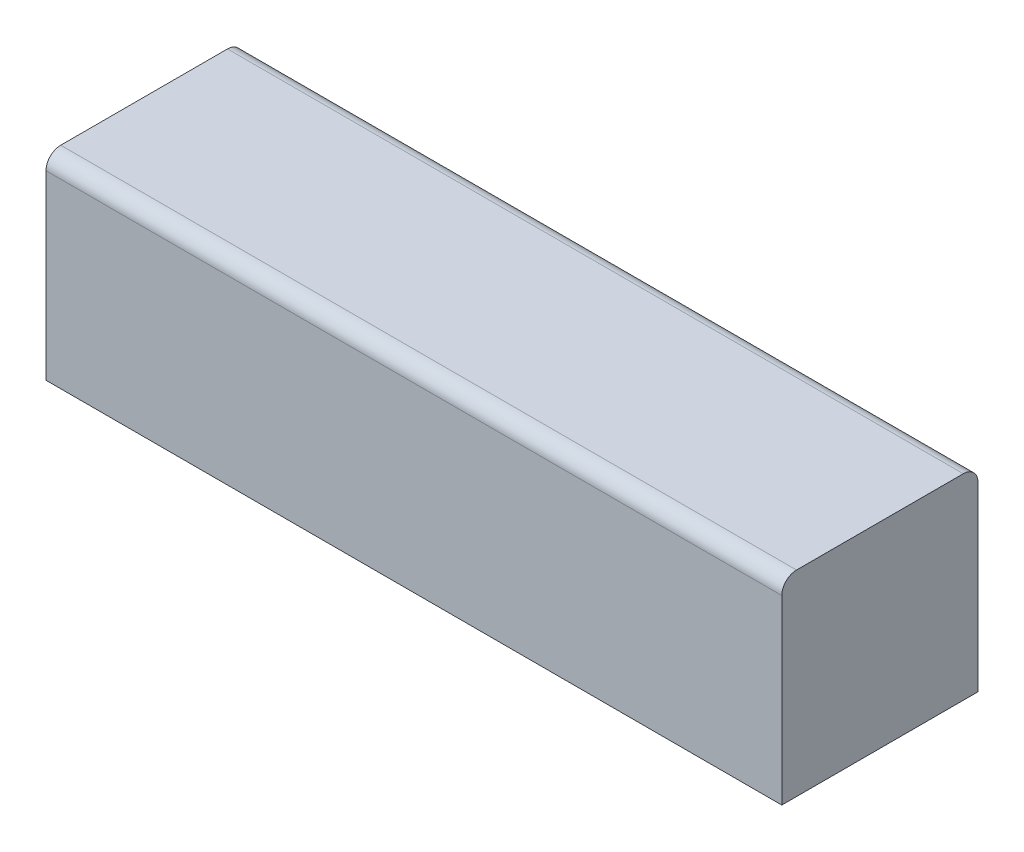
ISO-10303-21;
HEADER;
FILE_DESCRIPTION(('STEP AP214'),'2;1');
FILE_NAME('part.step','',(''),(''),'','','');
FILE_SCHEMA(('AUTOMOTIVE_DESIGN { 1 0 10303 214 1 1 1 1 }'));
ENDSEC;
DATA;
#1=APPLICATION_CONTEXT('core data for automotive mechanical design processes');
#2=APPLICATION_PROTOCOL_DEFINITION('international standard','automotive_design',2000,#1);
#3=PRODUCT_CONTEXT('',#1,'mechanical');
#4=PRODUCT('Part','Part','',(#3));
#5=PRODUCT_RELATED_PRODUCT_CATEGORY('part','',(#4));
#6=PRODUCT_DEFINITION_FORMATION('','',#4);
#7=PRODUCT_DEFINITION_CONTEXT('part definition',#1,'design');
#8=PRODUCT_DEFINITION('design','',#6,#7);
#9=PRODUCT_DEFINITION_SHAPE('','',#8);
#10=(LENGTH_UNIT() NAMED_UNIT(*) SI_UNIT(.MILLI.,.METRE.));
#11=(NAMED_UNIT(*) PLANE_ANGLE_UNIT() SI_UNIT($,.RADIAN.));
#12=(NAMED_UNIT(*) SI_UNIT($,.STERADIAN.) SOLID_ANGLE_UNIT());
#13=UNCERTAINTY_MEASURE_WITH_UNIT(LENGTH_MEASURE(1.E-05),#10,'distance_accuracy_value','');
#14=(GEOMETRIC_REPRESENTATION_CONTEXT(3) GLOBAL_UNCERTAINTY_ASSIGNED_CONTEXT((#13)) GLOBAL_UNIT_ASSIGNED_CONTEXT((#10,
#11,#12)) REPRESENTATION_CONTEXT('',''));
#15=CARTESIAN_POINT('',(0.,0.,0.));
#16=DIRECTION('',(0.,0.,1.));
#17=DIRECTION('',(1.,0.,0.));
#18=AXIS2_PLACEMENT_3D('',#15,#16,#17);
#19=CARTESIAN_POINT('',(75.,-20.,-20.));
#20=DIRECTION('',(0.,0.,1.));
#21=DIRECTION('',(1.,0.,0.));
#22=AXIS2_PLACEMENT_3D('',#19,#20,#21);
#23=PLANE('',#22);
#24=DIRECTION('',(0.,1.,0.));
#25=VECTOR('',#24,1.);
#26=CARTESIAN_POINT('',(-75.,-20.,-20.));
#27=LINE('',#26,#25);
#28=CARTESIAN_POINT('',(-75.,-20.,-20.));
#29=VERTEX_POINT('',#28);
#30=CARTESIAN_POINT('',(-75.,17.,-20.));
#31=VERTEX_POINT('',#30);
#32=EDGE_CURVE('E117',#29,#31,#27,.T.);
#33=ORIENTED_EDGE('',*,*,#32,.T.);
#34=DIRECTION('',(-1.,0.,0.));
#35=VECTOR('',#34,1.);
#36=CARTESIAN_POINT('',(75.,17.,-20.));
#37=LINE('',#36,#35);
#38=CARTESIAN_POINT('',(75.,17.,-20.));
#39=VERTEX_POINT('',#38);
#40=EDGE_CURVE('E11',#39,#31,#37,.T.);
#41=ORIENTED_EDGE('',*,*,#40,.F.);
#42=DIRECTION('',(0.,1.,0.));
#43=VECTOR('',#42,1.);
#44=CARTESIAN_POINT('',(75.,-20.,-20.));
#45=LINE('',#44,#43);
#46=CARTESIAN_POINT('',(75.,-20.,-20.));
#47=VERTEX_POINT('',#46);
#48=EDGE_CURVE('E127',#47,#39,#45,.T.);
#49=ORIENTED_EDGE('',*,*,#48,.F.);
#50=DIRECTION('',(-1.,0.,0.));
#51=VECTOR('',#50,1.);
#52=CARTESIAN_POINT('',(75.,-20.,-20.));
#53=LINE('',#52,#51);
#54=EDGE_CURVE('E113',#47,#29,#53,.T.);
#55=ORIENTED_EDGE('',*,*,#54,.T.);
#56=EDGE_LOOP('',(#33,#41,#49,#55));
#57=FACE_BOUND('',#56,.T.);
#58=ADVANCED_FACE('F33',(#57),#23,.F.);
#59=CARTESIAN_POINT('',(75.,17.,-17.));
#60=DIRECTION('',(-1.,0.,0.));
#61=DIRECTION('',(0.,0.,1.));
#62=AXIS2_PLACEMENT_3D('',#59,#60,#61);
#63=CYLINDRICAL_SURFACE('',#62,3.);
#64=CARTESIAN_POINT('',(-75.,17.,-17.));
#65=DIRECTION('',(1.,0.,0.));
#66=DIRECTION('',(0.,0.,-1.));
#67=AXIS2_PLACEMENT_3D('',#64,#65,#66);
#68=CIRCLE('',#67,3.);
#69=CARTESIAN_POINT('',(-75.,20.,-17.));
#70=VERTEX_POINT('',#69);
#71=EDGE_CURVE('E120',#31,#70,#68,.T.);
#72=ORIENTED_EDGE('',*,*,#71,.T.);
#73=DIRECTION('',(-1.,0.,0.));
#74=VECTOR('',#73,1.);
#75=CARTESIAN_POINT('',(75.,20.,-17.));
#76=LINE('',#75,#74);
#77=CARTESIAN_POINT('',(75.,20.,-17.));
#78=VERTEX_POINT('',#77);
#79=EDGE_CURVE('E41',#78,#70,#76,.T.);
#80=ORIENTED_EDGE('',*,*,#79,.F.);
#81=CARTESIAN_POINT('',(75.,17.,-17.));
#82=DIRECTION('',(1.,0.,0.));
#83=DIRECTION('',(0.,0.,-1.));
#84=AXIS2_PLACEMENT_3D('',#81,#82,#83);
#85=CIRCLE('',#84,3.);
#86=EDGE_CURVE('E86',#39,#78,#85,.T.);
#87=ORIENTED_EDGE('',*,*,#86,.F.);
#88=ORIENTED_EDGE('',*,*,#40,.T.);
#89=EDGE_LOOP('',(#72,#80,#87,#88));
#90=FACE_BOUND('',#89,.T.);
#91=ADVANCED_FACE('F151',(#90),#63,.T.);
#92=CARTESIAN_POINT('',(75.,20.,-17.));
#93=DIRECTION('',(0.,-1.,0.));
#94=DIRECTION('',(0.,0.,-1.));
#95=AXIS2_PLACEMENT_3D('',#92,#93,#94);
#96=PLANE('',#95);
#97=DIRECTION('',(0.,0.,1.));
#98=VECTOR('',#97,1.);
#99=CARTESIAN_POINT('',(-75.,20.,-17.));
#100=LINE('',#99,#98);
#101=CARTESIAN_POINT('',(-75.,20.,17.));
#102=VERTEX_POINT('',#101);
#103=EDGE_CURVE('E122',#70,#102,#100,.T.);
#104=ORIENTED_EDGE('',*,*,#103,.T.);
#105=DIRECTION('',(-1.,0.,0.));
#106=VECTOR('',#105,1.);
#107=CARTESIAN_POINT('',(75.,20.,17.));
#108=LINE('',#107,#106);
#109=CARTESIAN_POINT('',(75.,20.,17.));
#110=VERTEX_POINT('',#109);
#111=EDGE_CURVE('E108',#110,#102,#108,.T.);
#112=ORIENTED_EDGE('',*,*,#111,.F.);
#113=DIRECTION('',(0.,0.,1.));
#114=VECTOR('',#113,1.);
#115=CARTESIAN_POINT('',(75.,20.,-17.));
#116=LINE('',#115,#114);
#117=EDGE_CURVE('E99',#78,#110,#116,.T.);
#118=ORIENTED_EDGE('',*,*,#117,.F.);
#119=ORIENTED_EDGE('',*,*,#79,.T.);
#120=EDGE_LOOP('',(#104,#112,#118,#119));
#121=FACE_BOUND('',#120,.T.);
#122=ADVANCED_FACE('F133',(#121),#96,.F.);
#123=CARTESIAN_POINT('',(75.,17.,17.));
#124=DIRECTION('',(-1.,0.,0.));
#125=DIRECTION('',(0.,0.,1.));
#126=AXIS2_PLACEMENT_3D('',#123,#124,#125);
#127=CYLINDRICAL_SURFACE('',#126,3.);
#128=CARTESIAN_POINT('',(-75.,17.,17.));
#129=DIRECTION('',(1.,0.,0.));
#130=DIRECTION('',(0.,0.,-1.));
#131=AXIS2_PLACEMENT_3D('',#128,#129,#130);
#132=CIRCLE('',#131,3.);
#133=CARTESIAN_POINT('',(-75.,17.,20.));
#134=VERTEX_POINT('',#133);
#135=EDGE_CURVE('E107',#102,#134,#132,.T.);
#136=ORIENTED_EDGE('',*,*,#135,.T.);
#137=DIRECTION('',(-1.,0.,0.));
#138=VECTOR('',#137,1.);
#139=CARTESIAN_POINT('',(75.,17.,20.));
#140=LINE('',#139,#138);
#141=CARTESIAN_POINT('',(75.,17.,20.));
#142=VERTEX_POINT('',#141);
#143=EDGE_CURVE('E104',#142,#134,#140,.T.);
#144=ORIENTED_EDGE('',*,*,#143,.F.);
#145=CARTESIAN_POINT('',(75.,17.,17.));
#146=DIRECTION('',(1.,0.,0.));
#147=DIRECTION('',(0.,0.,-1.));
#148=AXIS2_PLACEMENT_3D('',#145,#146,#147);
#149=CIRCLE('',#148,3.);
#150=EDGE_CURVE('E93',#110,#142,#149,.T.);
#151=ORIENTED_EDGE('',*,*,#150,.F.);
#152=ORIENTED_EDGE('',*,*,#111,.T.);
#153=EDGE_LOOP('',(#136,#144,#151,#152));
#154=FACE_BOUND('',#153,.T.);
#155=ADVANCED_FACE('F105',(#154),#127,.T.);
#156=CARTESIAN_POINT('',(75.,-20.,20.));
#157=DIRECTION('',(0.,0.,-1.));
#158=DIRECTION('',(-1.,0.,0.));
#159=AXIS2_PLACEMENT_3D('',#156,#157,#158);
#160=PLANE('',#159);
#161=DIRECTION('',(0.,-1.,0.));
#162=VECTOR('',#161,1.);
#163=CARTESIAN_POINT('',(-75.,-20.,20.));
#164=LINE('',#163,#162);
#165=CARTESIAN_POINT('',(-75.,-20.,20.));
#166=VERTEX_POINT('',#165);
#167=EDGE_CURVE('E72',#134,#166,#164,.T.);
#168=ORIENTED_EDGE('',*,*,#167,.T.);
#169=DIRECTION('',(-1.,0.,0.));
#170=VECTOR('',#169,1.);
#171=CARTESIAN_POINT('',(75.,-20.,20.));
#172=LINE('',#171,#170);
#173=CARTESIAN_POINT('',(75.,-20.,20.));
#174=VERTEX_POINT('',#173);
#175=EDGE_CURVE('E109',#174,#166,#172,.T.);
#176=ORIENTED_EDGE('',*,*,#175,.F.);
#177=DIRECTION('',(0.,-1.,0.));
#178=VECTOR('',#177,1.);
#179=CARTESIAN_POINT('',(75.,-20.,20.));
#180=LINE('',#179,#178);
#181=EDGE_CURVE('E97',#142,#174,#180,.T.);
#182=ORIENTED_EDGE('',*,*,#181,.F.);
#183=ORIENTED_EDGE('',*,*,#143,.T.);
#184=EDGE_LOOP('',(#168,#176,#182,#183));
#185=FACE_BOUND('',#184,.T.);
#186=ADVANCED_FACE('F111',(#185),#160,.F.);
#187=CARTESIAN_POINT('',(75.,-20.,-20.));
#188=DIRECTION('',(0.,1.,0.));
#189=DIRECTION('',(0.,0.,1.));
#190=AXIS2_PLACEMENT_3D('',#187,#188,#189);
#191=PLANE('',#190);
#192=DIRECTION('',(0.,0.,-1.));
#193=VECTOR('',#192,1.);
#194=CARTESIAN_POINT('',(-75.,-20.,-20.));
#195=LINE('',#194,#193);
#196=EDGE_CURVE('E78',#166,#29,#195,.T.);
#197=ORIENTED_EDGE('',*,*,#196,.T.);
#198=ORIENTED_EDGE('',*,*,#54,.F.);
#199=DIRECTION('',(0.,0.,-1.));
#200=VECTOR('',#199,1.);
#201=CARTESIAN_POINT('',(75.,-20.,-20.));
#202=LINE('',#201,#200);
#203=EDGE_CURVE('E49',#174,#47,#202,.T.);
#204=ORIENTED_EDGE('',*,*,#203,.F.);
#205=ORIENTED_EDGE('',*,*,#175,.T.);
#206=EDGE_LOOP('',(#197,#198,#204,#205));
#207=FACE_BOUND('',#206,.T.);
#208=ADVANCED_FACE('F140',(#207),#191,.F.);
#209=CARTESIAN_POINT('',(75.,17.,-17.));
#210=DIRECTION('',(1.,0.,0.));
#211=DIRECTION('',(0.,0.,-1.));
#212=AXIS2_PLACEMENT_3D('',#209,#210,#211);
#213=PLANE('',#212);
#214=ORIENTED_EDGE('',*,*,#48,.T.);
#215=ORIENTED_EDGE('',*,*,#86,.T.);
#216=ORIENTED_EDGE('',*,*,#117,.T.);
#217=ORIENTED_EDGE('',*,*,#150,.T.);
#218=ORIENTED_EDGE('',*,*,#181,.T.);
#219=ORIENTED_EDGE('',*,*,#203,.T.);
#220=EDGE_LOOP('',(#214,#215,#216,#217,#218,#219));
#221=FACE_BOUND('',#220,.T.);
#222=ADVANCED_FACE('F95',(#221),#213,.T.);
#223=CARTESIAN_POINT('',(-75.,17.,-17.));
#224=DIRECTION('',(1.,0.,0.));
#225=DIRECTION('',(0.,0.,-1.));
#226=AXIS2_PLACEMENT_3D('',#223,#224,#225);
#227=PLANE('',#226);
#228=ORIENTED_EDGE('',*,*,#32,.F.);
#229=ORIENTED_EDGE('',*,*,#196,.F.);
#230=ORIENTED_EDGE('',*,*,#167,.F.);
#231=ORIENTED_EDGE('',*,*,#135,.F.);
#232=ORIENTED_EDGE('',*,*,#103,.F.);
#233=ORIENTED_EDGE('',*,*,#71,.F.);
#234=EDGE_LOOP('',(#228,#229,#230,#231,#232,#233));
#235=FACE_BOUND('',#234,.T.);
#236=ADVANCED_FACE('F136',(#235),#227,.F.);
#237=CLOSED_SHELL('',(#58,#91,#122,#155,#186,#208,#222,#236));
#238=MANIFOLD_SOLID_BREP('B2',#237);
#239=ADVANCED_BREP_SHAPE_REPRESENTATION('',(#18,#238),#14);
#240=SHAPE_DEFINITION_REPRESENTATION(#9,#239);
ENDSEC;
END-ISO-10303-21;
